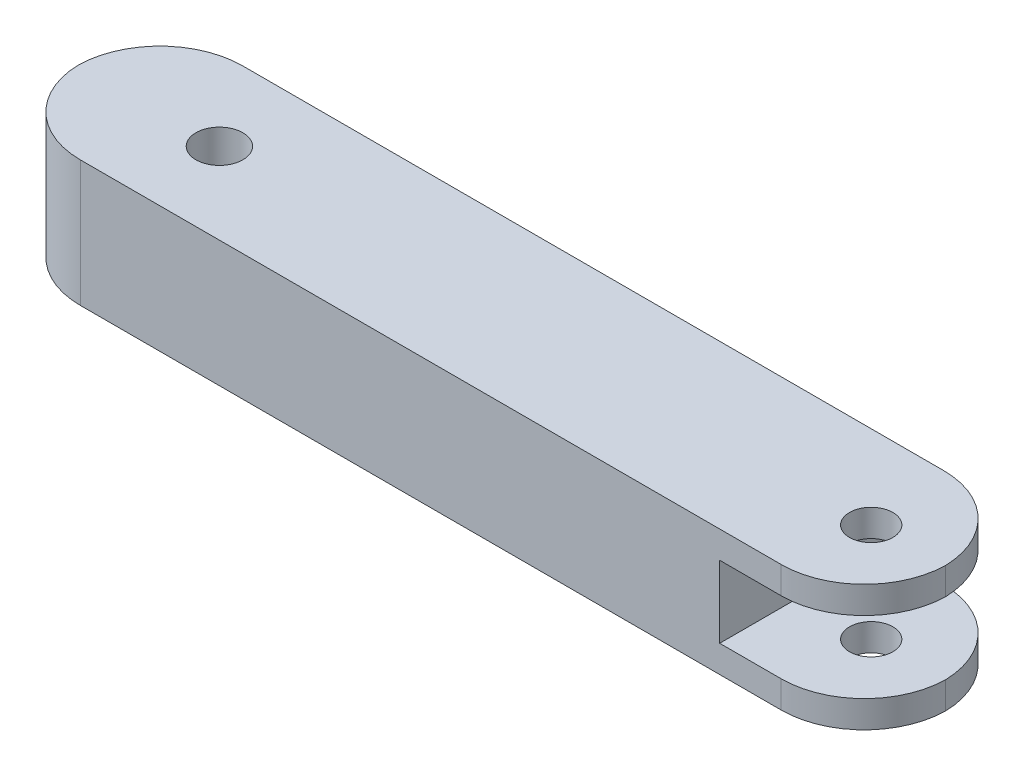
ISO-10303-21;
HEADER;
FILE_DESCRIPTION(('STEP AP214'),'2;1');
FILE_NAME('part.step','',(''),(''),'','','');
FILE_SCHEMA(('AUTOMOTIVE_DESIGN { 1 0 10303 214 1 1 1 1 }'));
ENDSEC;
DATA;
#1=APPLICATION_CONTEXT('core data for automotive mechanical design processes');
#2=APPLICATION_PROTOCOL_DEFINITION('international standard','automotive_design',2000,#1);
#3=PRODUCT_CONTEXT('',#1,'mechanical');
#4=PRODUCT('Part','Part','',(#3));
#5=PRODUCT_RELATED_PRODUCT_CATEGORY('part','',(#4));
#6=PRODUCT_DEFINITION_FORMATION('','',#4);
#7=PRODUCT_DEFINITION_CONTEXT('part definition',#1,'design');
#8=PRODUCT_DEFINITION('design','',#6,#7);
#9=PRODUCT_DEFINITION_SHAPE('','',#8);
#10=(LENGTH_UNIT() NAMED_UNIT(*) SI_UNIT(.MILLI.,.METRE.));
#11=(NAMED_UNIT(*) PLANE_ANGLE_UNIT() SI_UNIT($,.RADIAN.));
#12=(NAMED_UNIT(*) SI_UNIT($,.STERADIAN.) SOLID_ANGLE_UNIT());
#13=UNCERTAINTY_MEASURE_WITH_UNIT(LENGTH_MEASURE(1.E-05),#10,'distance_accuracy_value','');
#14=(GEOMETRIC_REPRESENTATION_CONTEXT(3) GLOBAL_UNCERTAINTY_ASSIGNED_CONTEXT((#13)) GLOBAL_UNIT_ASSIGNED_CONTEXT((#10,
#11,#12)) REPRESENTATION_CONTEXT('',''));
#15=CARTESIAN_POINT('',(0.,0.,0.));
#16=DIRECTION('',(0.,0.,1.));
#17=DIRECTION('',(1.,0.,0.));
#18=AXIS2_PLACEMENT_3D('',#15,#16,#17);
#19=CARTESIAN_POINT('',(-29.569717112966,10.819,11.4289156626506));
#20=DIRECTION('',(0.,0.,-1.));
#21=DIRECTION('',(-1.,0.,0.));
#22=AXIS2_PLACEMENT_3D('',#19,#20,#21);
#23=PLANE('',#22);
#24=DIRECTION('',(1.,0.,0.));
#25=VECTOR('',#24,1.);
#26=CARTESIAN_POINT('',(-29.569717112966,2.325,11.4289156626506));
#27=LINE('',#26,#25);
#28=CARTESIAN_POINT('',(32.4285979053255,2.325,11.4289156626506));
#29=VERTEX_POINT('',#28);
#30=CARTESIAN_POINT('',(37.700282887034,2.325,11.4289156626506));
#31=VERTEX_POINT('',#30);
#32=EDGE_CURVE('E155',#29,#31,#27,.T.);
#33=ORIENTED_EDGE('',*,*,#32,.F.);
#34=DIRECTION('',(0.,1.,0.));
#35=VECTOR('',#34,1.);
#36=CARTESIAN_POINT('',(32.4285979053255,10.819,11.4289156626506));
#37=LINE('',#36,#35);
#38=CARTESIAN_POINT('',(32.4285979053255,8.494,11.4289156626506));
#39=VERTEX_POINT('',#38);
#40=EDGE_CURVE('E140',#29,#39,#37,.T.);
#41=ORIENTED_EDGE('',*,*,#40,.T.);
#42=DIRECTION('',(1.,0.,0.));
#43=VECTOR('',#42,1.);
#44=CARTESIAN_POINT('',(-29.569717112966,8.494,11.4289156626506));
#45=LINE('',#44,#43);
#46=CARTESIAN_POINT('',(37.700282887034,8.494,11.4289156626506));
#47=VERTEX_POINT('',#46);
#48=EDGE_CURVE('E147',#39,#47,#45,.T.);
#49=ORIENTED_EDGE('',*,*,#48,.T.);
#50=DIRECTION('',(0.,-1.,0.));
#51=VECTOR('',#50,1.);
#52=CARTESIAN_POINT('',(37.700282887034,10.819,11.4289156626506));
#53=LINE('',#52,#51);
#54=CARTESIAN_POINT('',(37.700282887034,10.819,11.4289156626506));
#55=VERTEX_POINT('',#54);
#56=EDGE_CURVE('E165',#47,#55,#53,.F.);
#57=ORIENTED_EDGE('',*,*,#56,.T.);
#58=DIRECTION('',(1.,0.,0.));
#59=VECTOR('',#58,1.);
#60=CARTESIAN_POINT('',(-29.569717112966,10.819,11.4289156626506));
#61=LINE('',#60,#59);
#62=CARTESIAN_POINT('',(-22.439717112966,10.819,11.4289156626506));
#63=VERTEX_POINT('',#62);
#64=EDGE_CURVE('E159',#63,#55,#61,.T.);
#65=ORIENTED_EDGE('',*,*,#64,.F.);
#66=DIRECTION('',(0.,-1.,0.));
#67=VECTOR('',#66,1.);
#68=CARTESIAN_POINT('',(-22.439717112966,10.819,11.4289156626506));
#69=LINE('',#68,#67);
#70=CARTESIAN_POINT('',(-22.439717112966,0.,11.4289156626506));
#71=VERTEX_POINT('',#70);
#72=EDGE_CURVE('E175',#63,#71,#69,.T.);
#73=ORIENTED_EDGE('',*,*,#72,.T.);
#74=DIRECTION('',(1.,0.,0.));
#75=VECTOR('',#74,1.);
#76=CARTESIAN_POINT('',(-29.569717112966,0.,11.4289156626506));
#77=LINE('',#76,#75);
#78=CARTESIAN_POINT('',(37.700282887034,0.,11.4289156626506));
#79=VERTEX_POINT('',#78);
#80=EDGE_CURVE('E166',#71,#79,#77,.T.);
#81=ORIENTED_EDGE('',*,*,#80,.T.);
#82=EDGE_CURVE('E172',#79,#31,#53,.F.);
#83=ORIENTED_EDGE('',*,*,#82,.T.);
#84=EDGE_LOOP('',(#33,#41,#49,#57,#65,#73,#81,#83));
#85=FACE_BOUND('',#84,.T.);
#86=ADVANCED_FACE('F38',(#85),#23,.F.);
#87=CARTESIAN_POINT('',(-29.569717112966,10.819,-2.5210843373494));
#88=DIRECTION('',(0.,0.,1.));
#89=DIRECTION('',(1.,0.,0.));
#90=AXIS2_PLACEMENT_3D('',#87,#88,#89);
#91=PLANE('',#90);
#92=DIRECTION('',(-1.,0.,0.));
#93=VECTOR('',#92,1.);
#94=CARTESIAN_POINT('',(32.4285979053255,2.325,-2.5210843373494));
#95=LINE('',#94,#93);
#96=CARTESIAN_POINT('',(37.700282887034,2.325,-2.5210843373494));
#97=VERTEX_POINT('',#96);
#98=CARTESIAN_POINT('',(32.4285979053255,2.325,-2.5210843373494));
#99=VERTEX_POINT('',#98);
#100=EDGE_CURVE('E123',#97,#99,#95,.T.);
#101=ORIENTED_EDGE('',*,*,#100,.F.);
#102=DIRECTION('',(0.,-1.,0.));
#103=VECTOR('',#102,1.);
#104=CARTESIAN_POINT('',(37.700282887034,10.819,-2.5210843373494));
#105=LINE('',#104,#103);
#106=CARTESIAN_POINT('',(37.700282887034,0.,-2.5210843373494));
#107=VERTEX_POINT('',#106);
#108=EDGE_CURVE('E194',#97,#107,#105,.T.);
#109=ORIENTED_EDGE('',*,*,#108,.T.);
#110=DIRECTION('',(-1.,0.,0.));
#111=VECTOR('',#110,1.);
#112=CARTESIAN_POINT('',(-29.569717112966,0.,-2.5210843373494));
#113=LINE('',#112,#111);
#114=CARTESIAN_POINT('',(-22.439717112966,0.,-2.5210843373494));
#115=VERTEX_POINT('',#114);
#116=EDGE_CURVE('E163',#107,#115,#113,.T.);
#117=ORIENTED_EDGE('',*,*,#116,.T.);
#118=DIRECTION('',(0.,-1.,0.));
#119=VECTOR('',#118,1.);
#120=CARTESIAN_POINT('',(-22.439717112966,10.819,-2.5210843373494));
#121=LINE('',#120,#119);
#122=CARTESIAN_POINT('',(-22.439717112966,10.819,-2.5210843373494));
#123=VERTEX_POINT('',#122);
#124=EDGE_CURVE('E197',#115,#123,#121,.F.);
#125=ORIENTED_EDGE('',*,*,#124,.T.);
#126=DIRECTION('',(-1.,0.,0.));
#127=VECTOR('',#126,1.);
#128=CARTESIAN_POINT('',(-29.569717112966,10.819,-2.5210843373494));
#129=LINE('',#128,#127);
#130=CARTESIAN_POINT('',(37.700282887034,10.819,-2.5210843373494));
#131=VERTEX_POINT('',#130);
#132=EDGE_CURVE('E162',#131,#123,#129,.T.);
#133=ORIENTED_EDGE('',*,*,#132,.F.);
#134=CARTESIAN_POINT('',(37.700282887034,8.494,-2.5210843373494));
#135=VERTEX_POINT('',#134);
#136=EDGE_CURVE('E195',#131,#135,#105,.T.);
#137=ORIENTED_EDGE('',*,*,#136,.T.);
#138=DIRECTION('',(-1.,0.,0.));
#139=VECTOR('',#138,1.);
#140=CARTESIAN_POINT('',(32.4285979053255,8.494,-2.5210843373494));
#141=LINE('',#140,#139);
#142=CARTESIAN_POINT('',(32.4285979053255,8.494,-2.5210843373494));
#143=VERTEX_POINT('',#142);
#144=EDGE_CURVE('E141',#135,#143,#141,.T.);
#145=ORIENTED_EDGE('',*,*,#144,.T.);
#146=DIRECTION('',(0.,1.,0.));
#147=VECTOR('',#146,1.);
#148=CARTESIAN_POINT('',(32.4285979053255,2.325,-2.5210843373494));
#149=LINE('',#148,#147);
#150=EDGE_CURVE('E133',#99,#143,#149,.T.);
#151=ORIENTED_EDGE('',*,*,#150,.F.);
#152=EDGE_LOOP('',(#101,#109,#117,#125,#133,#137,#145,#151));
#153=FACE_BOUND('',#152,.T.);
#154=ADVANCED_FACE('F144',(#153),#91,.F.);
#155=CARTESIAN_POINT('',(37.700282887034,10.819,4.6089156626506));
#156=DIRECTION('',(0.,-1.,0.));
#157=DIRECTION('',(0.,0.,-1.));
#158=AXIS2_PLACEMENT_3D('',#155,#156,#157);
#159=CYLINDRICAL_SURFACE('',#158,7.13);
#160=ORIENTED_EDGE('',*,*,#108,.F.);
#161=CARTESIAN_POINT('',(37.700282887034,2.325,4.6089156626506));
#162=DIRECTION('',(0.,1.,0.));
#163=DIRECTION('',(0.,0.,1.));
#164=AXIS2_PLACEMENT_3D('',#161,#162,#163);
#165=CIRCLE('',#164,7.13);
#166=CARTESIAN_POINT('',(44.8285979053255,2.325,4.4539156626506));
#167=VERTEX_POINT('',#166);
#168=EDGE_CURVE('E129',#97,#167,#165,.F.);
#169=ORIENTED_EDGE('',*,*,#168,.T.);
#170=DIRECTION('',(0.,-1.,0.));
#171=VECTOR('',#170,1.);
#172=CARTESIAN_POINT('',(44.8285979053255,5.4095,4.4539156626506));
#173=LINE('',#172,#171);
#174=CARTESIAN_POINT('',(44.8285979053255,0.,4.4539156626506));
#175=VERTEX_POINT('',#174);
#176=EDGE_CURVE('E201',#175,#167,#173,.F.);
#177=ORIENTED_EDGE('',*,*,#176,.F.);
#178=CARTESIAN_POINT('',(37.700282887034,0.,4.6089156626506));
#179=DIRECTION('',(0.,-1.,0.));
#180=DIRECTION('',(0.,0.,-1.));
#181=AXIS2_PLACEMENT_3D('',#178,#179,#180);
#182=CIRCLE('',#181,7.13);
#183=EDGE_CURVE('E178',#107,#175,#182,.T.);
#184=ORIENTED_EDGE('',*,*,#183,.F.);
#185=EDGE_LOOP('',(#160,#169,#177,#184));
#186=FACE_BOUND('',#185,.T.);
#187=ADVANCED_FACE('F230',(#186),#159,.T.);
#188=CARTESIAN_POINT('',(37.700282887034,10.819,4.2989156626506));
#189=DIRECTION('',(0.,-1.,0.));
#190=DIRECTION('',(0.,0.,-1.));
#191=AXIS2_PLACEMENT_3D('',#188,#189,#190);
#192=CYLINDRICAL_SURFACE('',#191,7.13);
#193=ORIENTED_EDGE('',*,*,#176,.T.);
#194=CARTESIAN_POINT('',(37.700282887034,2.325,4.2989156626506));
#195=DIRECTION('',(0.,1.,0.));
#196=DIRECTION('',(0.,0.,1.));
#197=AXIS2_PLACEMENT_3D('',#194,#195,#196);
#198=CIRCLE('',#197,7.13);
#199=EDGE_CURVE('E11',#167,#31,#198,.F.);
#200=ORIENTED_EDGE('',*,*,#199,.T.);
#201=ORIENTED_EDGE('',*,*,#82,.F.);
#202=CARTESIAN_POINT('',(37.700282887034,0.,4.2989156626506));
#203=DIRECTION('',(0.,-1.,0.));
#204=DIRECTION('',(0.,0.,-1.));
#205=AXIS2_PLACEMENT_3D('',#202,#203,#204);
#206=CIRCLE('',#205,7.13);
#207=EDGE_CURVE('E180',#175,#79,#206,.T.);
#208=ORIENTED_EDGE('',*,*,#207,.F.);
#209=EDGE_LOOP('',(#193,#200,#201,#208));
#210=FACE_BOUND('',#209,.T.);
#211=ADVANCED_FACE('F235',(#210),#192,.T.);
#212=CARTESIAN_POINT('',(0.,10.819,0.));
#213=DIRECTION('',(0.,-1.,0.));
#214=DIRECTION('',(0.,0.,-1.));
#215=AXIS2_PLACEMENT_3D('',#212,#213,#214);
#216=PLANE('',#215);
#217=CARTESIAN_POINT('',(-17.4780321312575,10.819,4.4539156626506));
#218=DIRECTION('',(0.,-1.,0.));
#219=DIRECTION('',(0.,0.,-1.));
#220=AXIS2_PLACEMENT_3D('',#217,#218,#219);
#221=CIRCLE('',#220,2.015);
#222=CARTESIAN_POINT('',(-17.4780321312575,10.819,2.4389156626506));
#223=VERTEX_POINT('',#222);
#224=EDGE_CURVE('E281',#223,#223,#221,.T.);
#225=ORIENTED_EDGE('',*,*,#224,.T.);
#226=EDGE_LOOP('',(#225));
#227=FACE_BOUND('',#226,.T.);
#228=CARTESIAN_POINT('',(38.6285979053255,10.819,4.62985196275662));
#229=DIRECTION('',(0.,-1.,0.));
#230=DIRECTION('',(0.,0.,-1.));
#231=AXIS2_PLACEMENT_3D('',#228,#229,#230);
#232=CIRCLE('',#231,1.86000000000001);
#233=CARTESIAN_POINT('',(38.6285979053255,10.819,2.76985196275661));
#234=VERTEX_POINT('',#233);
#235=EDGE_CURVE('E288',#234,#234,#232,.T.);
#236=ORIENTED_EDGE('',*,*,#235,.T.);
#237=EDGE_LOOP('',(#236));
#238=FACE_BOUND('',#237,.T.);
#239=CARTESIAN_POINT('',(-22.439717112966,10.819,4.6089156626506));
#240=DIRECTION('',(0.,-1.,0.));
#241=DIRECTION('',(0.,0.,-1.));
#242=AXIS2_PLACEMENT_3D('',#239,#240,#241);
#243=CIRCLE('',#242,7.13);
#244=CARTESIAN_POINT('',(-29.5680321312575,10.819,4.4539156626506));
#245=VERTEX_POINT('',#244);
#246=EDGE_CURVE('E62',#123,#245,#243,.F.);
#247=ORIENTED_EDGE('',*,*,#246,.T.);
#248=CARTESIAN_POINT('',(-22.439717112966,10.819,4.2989156626506));
#249=DIRECTION('',(0.,-1.,0.));
#250=DIRECTION('',(0.,0.,-1.));
#251=AXIS2_PLACEMENT_3D('',#248,#249,#250);
#252=CIRCLE('',#251,7.13);
#253=EDGE_CURVE('E192',#245,#63,#252,.F.);
#254=ORIENTED_EDGE('',*,*,#253,.T.);
#255=ORIENTED_EDGE('',*,*,#64,.T.);
#256=CARTESIAN_POINT('',(37.700282887034,10.819,4.2989156626506));
#257=DIRECTION('',(0.,-1.,0.));
#258=DIRECTION('',(0.,0.,-1.));
#259=AXIS2_PLACEMENT_3D('',#256,#257,#258);
#260=CIRCLE('',#259,7.13);
#261=CARTESIAN_POINT('',(44.8285979053255,10.819,4.4539156626506));
#262=VERTEX_POINT('',#261);
#263=EDGE_CURVE('E188',#55,#262,#260,.F.);
#264=ORIENTED_EDGE('',*,*,#263,.T.);
#265=CARTESIAN_POINT('',(37.700282887034,10.819,4.6089156626506));
#266=DIRECTION('',(0.,-1.,0.));
#267=DIRECTION('',(0.,0.,-1.));
#268=AXIS2_PLACEMENT_3D('',#265,#266,#267);
#269=CIRCLE('',#268,7.13);
#270=EDGE_CURVE('E186',#262,#131,#269,.F.);
#271=ORIENTED_EDGE('',*,*,#270,.T.);
#272=ORIENTED_EDGE('',*,*,#132,.T.);
#273=EDGE_LOOP('',(#247,#254,#255,#264,#271,#272));
#274=FACE_BOUND('',#273,.T.);
#275=ADVANCED_FACE('F213',(#227,#238,#274),#216,.F.);
#276=CARTESIAN_POINT('',(0.,0.,0.));
#277=DIRECTION('',(0.,-1.,0.));
#278=DIRECTION('',(0.,0.,-1.));
#279=AXIS2_PLACEMENT_3D('',#276,#277,#278);
#280=PLANE('',#279);
#281=CARTESIAN_POINT('',(-17.4780321312575,0.,4.4539156626506));
#282=DIRECTION('',(0.,-1.,0.));
#283=DIRECTION('',(0.,0.,-1.));
#284=AXIS2_PLACEMENT_3D('',#281,#282,#283);
#285=CIRCLE('',#284,2.015);
#286=CARTESIAN_POINT('',(-17.4780321312575,0.,2.4389156626506));
#287=VERTEX_POINT('',#286);
#288=EDGE_CURVE('E283',#287,#287,#285,.T.);
#289=ORIENTED_EDGE('',*,*,#288,.F.);
#290=EDGE_LOOP('',(#289));
#291=FACE_BOUND('',#290,.T.);
#292=CARTESIAN_POINT('',(38.6285979053255,0.,4.62985196275662));
#293=DIRECTION('',(0.,-1.,0.));
#294=DIRECTION('',(0.,0.,-1.));
#295=AXIS2_PLACEMENT_3D('',#292,#293,#294);
#296=CIRCLE('',#295,1.86000000000001);
#297=CARTESIAN_POINT('',(38.6285979053255,0.,2.76985196275661));
#298=VERTEX_POINT('',#297);
#299=EDGE_CURVE('E285',#298,#298,#296,.T.);
#300=ORIENTED_EDGE('',*,*,#299,.F.);
#301=EDGE_LOOP('',(#300));
#302=FACE_BOUND('',#301,.T.);
#303=ORIENTED_EDGE('',*,*,#80,.F.);
#304=CARTESIAN_POINT('',(-22.439717112966,0.,4.2989156626506));
#305=DIRECTION('',(0.,-1.,0.));
#306=DIRECTION('',(0.,0.,-1.));
#307=AXIS2_PLACEMENT_3D('',#304,#305,#306);
#308=CIRCLE('',#307,7.13);
#309=CARTESIAN_POINT('',(-29.5680321312575,0.,4.4539156626506));
#310=VERTEX_POINT('',#309);
#311=EDGE_CURVE('E184',#71,#310,#308,.T.);
#312=ORIENTED_EDGE('',*,*,#311,.T.);
#313=CARTESIAN_POINT('',(-22.439717112966,0.,4.6089156626506));
#314=DIRECTION('',(0.,-1.,0.));
#315=DIRECTION('',(0.,0.,-1.));
#316=AXIS2_PLACEMENT_3D('',#313,#314,#315);
#317=CIRCLE('',#316,7.13);
#318=EDGE_CURVE('E182',#310,#115,#317,.T.);
#319=ORIENTED_EDGE('',*,*,#318,.T.);
#320=ORIENTED_EDGE('',*,*,#116,.F.);
#321=ORIENTED_EDGE('',*,*,#183,.T.);
#322=ORIENTED_EDGE('',*,*,#207,.T.);
#323=EDGE_LOOP('',(#303,#312,#319,#320,#321,#322));
#324=FACE_BOUND('',#323,.T.);
#325=ADVANCED_FACE('F221',(#291,#302,#324),#280,.T.);
#326=CARTESIAN_POINT('',(-22.439717112966,10.819,4.6089156626506));
#327=DIRECTION('',(0.,-1.,0.));
#328=DIRECTION('',(0.,0.,-1.));
#329=AXIS2_PLACEMENT_3D('',#326,#327,#328);
#330=CYLINDRICAL_SURFACE('',#329,7.13);
#331=DIRECTION('',(0.,-1.,0.));
#332=VECTOR('',#331,1.);
#333=CARTESIAN_POINT('',(-29.5680321312575,5.4095,4.4539156626506));
#334=LINE('',#333,#332);
#335=EDGE_CURVE('E169',#245,#310,#334,.T.);
#336=ORIENTED_EDGE('',*,*,#335,.F.);
#337=ORIENTED_EDGE('',*,*,#246,.F.);
#338=ORIENTED_EDGE('',*,*,#124,.F.);
#339=ORIENTED_EDGE('',*,*,#318,.F.);
#340=EDGE_LOOP('',(#336,#337,#338,#339));
#341=FACE_BOUND('',#340,.T.);
#342=ADVANCED_FACE('F225',(#341),#330,.T.);
#343=CARTESIAN_POINT('',(-22.439717112966,10.819,4.2989156626506));
#344=DIRECTION('',(0.,-1.,0.));
#345=DIRECTION('',(0.,0.,-1.));
#346=AXIS2_PLACEMENT_3D('',#343,#344,#345);
#347=CYLINDRICAL_SURFACE('',#346,7.13);
#348=ORIENTED_EDGE('',*,*,#253,.F.);
#349=ORIENTED_EDGE('',*,*,#335,.T.);
#350=ORIENTED_EDGE('',*,*,#311,.F.);
#351=ORIENTED_EDGE('',*,*,#72,.F.);
#352=EDGE_LOOP('',(#348,#349,#350,#351));
#353=FACE_BOUND('',#352,.T.);
#354=ADVANCED_FACE('F218',(#353),#347,.T.);
#355=CARTESIAN_POINT('',(37.700282887034,8.494,4.6089156626506));
#356=DIRECTION('',(0.,1.,0.));
#357=DIRECTION('',(0.,0.,1.));
#358=AXIS2_PLACEMENT_3D('',#355,#356,#357);
#359=CIRCLE('',#358,7.13);
#360=CARTESIAN_POINT('',(44.8285979053255,8.494,4.4539156626506));
#361=VERTEX_POINT('',#360);
#362=EDGE_CURVE('E54',#135,#361,#359,.F.);
#363=ORIENTED_EDGE('',*,*,#362,.F.);
#364=ORIENTED_EDGE('',*,*,#136,.F.);
#365=ORIENTED_EDGE('',*,*,#270,.F.);
#366=EDGE_CURVE('E158',#361,#262,#173,.F.);
#367=ORIENTED_EDGE('',*,*,#366,.F.);
#368=EDGE_LOOP('',(#363,#364,#365,#367));
#369=FACE_BOUND('',#368,.T.);
#370=ADVANCED_FACE('F40',(#369),#159,.T.);
#371=CARTESIAN_POINT('',(37.700282887034,8.494,4.2989156626506));
#372=DIRECTION('',(0.,1.,0.));
#373=DIRECTION('',(0.,0.,1.));
#374=AXIS2_PLACEMENT_3D('',#371,#372,#373);
#375=CIRCLE('',#374,7.13);
#376=EDGE_CURVE('E47',#361,#47,#375,.F.);
#377=ORIENTED_EDGE('',*,*,#376,.F.);
#378=ORIENTED_EDGE('',*,*,#366,.T.);
#379=ORIENTED_EDGE('',*,*,#263,.F.);
#380=ORIENTED_EDGE('',*,*,#56,.F.);
#381=EDGE_LOOP('',(#377,#378,#379,#380));
#382=FACE_BOUND('',#381,.T.);
#383=ADVANCED_FACE('F211',(#382),#192,.T.);
#384=CARTESIAN_POINT('',(32.4285979053255,2.325,-2.5210843373494));
#385=DIRECTION('',(-1.,0.,0.));
#386=DIRECTION('',(0.,0.,1.));
#387=AXIS2_PLACEMENT_3D('',#384,#385,#386);
#388=PLANE('',#387);
#389=DIRECTION('',(0.,0.,1.));
#390=VECTOR('',#389,1.);
#391=CARTESIAN_POINT('',(32.4285979053255,2.325,-2.5210843373494));
#392=LINE('',#391,#390);
#393=EDGE_CURVE('E126',#99,#29,#392,.T.);
#394=ORIENTED_EDGE('',*,*,#393,.F.);
#395=ORIENTED_EDGE('',*,*,#150,.T.);
#396=DIRECTION('',(0.,0.,1.));
#397=VECTOR('',#396,1.);
#398=CARTESIAN_POINT('',(32.4285979053255,8.494,-2.5210843373494));
#399=LINE('',#398,#397);
#400=EDGE_CURVE('E295',#143,#39,#399,.T.);
#401=ORIENTED_EDGE('',*,*,#400,.T.);
#402=ORIENTED_EDGE('',*,*,#40,.F.);
#403=EDGE_LOOP('',(#394,#395,#401,#402));
#404=FACE_BOUND('',#403,.T.);
#405=ADVANCED_FACE('F136',(#404),#388,.F.);
#406=CARTESIAN_POINT('',(0.,2.325,0.));
#407=DIRECTION('',(0.,1.,0.));
#408=DIRECTION('',(0.,0.,1.));
#409=AXIS2_PLACEMENT_3D('',#406,#407,#408);
#410=PLANE('',#409);
#411=CARTESIAN_POINT('',(38.6285979053255,2.325,4.62985196275662));
#412=DIRECTION('',(0.,1.,0.));
#413=DIRECTION('',(0.,0.,1.));
#414=AXIS2_PLACEMENT_3D('',#411,#412,#413);
#415=CIRCLE('',#414,1.86000000000001);
#416=CARTESIAN_POINT('',(38.6285979053255,2.325,6.48985196275663));
#417=VERTEX_POINT('',#416);
#418=EDGE_CURVE('E293',#417,#417,#415,.T.);
#419=ORIENTED_EDGE('',*,*,#418,.F.);
#420=EDGE_LOOP('',(#419));
#421=FACE_BOUND('',#420,.T.);
#422=ORIENTED_EDGE('',*,*,#32,.T.);
#423=ORIENTED_EDGE('',*,*,#199,.F.);
#424=ORIENTED_EDGE('',*,*,#168,.F.);
#425=ORIENTED_EDGE('',*,*,#100,.T.);
#426=ORIENTED_EDGE('',*,*,#393,.T.);
#427=EDGE_LOOP('',(#422,#423,#424,#425,#426));
#428=FACE_BOUND('',#427,.T.);
#429=ADVANCED_FACE('F125',(#421,#428),#410,.T.);
#430=CARTESIAN_POINT('',(0.,8.494,0.));
#431=DIRECTION('',(0.,1.,0.));
#432=DIRECTION('',(0.,0.,1.));
#433=AXIS2_PLACEMENT_3D('',#430,#431,#432);
#434=PLANE('',#433);
#435=CARTESIAN_POINT('',(38.6285979053255,8.494,4.62985196275662));
#436=DIRECTION('',(0.,1.,0.));
#437=DIRECTION('',(0.,0.,1.));
#438=AXIS2_PLACEMENT_3D('',#435,#436,#437);
#439=CIRCLE('',#438,1.86000000000001);
#440=CARTESIAN_POINT('',(38.6285979053255,8.494,6.48985196275663));
#441=VERTEX_POINT('',#440);
#442=EDGE_CURVE('E42',#441,#441,#439,.T.);
#443=ORIENTED_EDGE('',*,*,#442,.T.);
#444=EDGE_LOOP('',(#443));
#445=FACE_BOUND('',#444,.T.);
#446=ORIENTED_EDGE('',*,*,#400,.F.);
#447=ORIENTED_EDGE('',*,*,#144,.F.);
#448=ORIENTED_EDGE('',*,*,#362,.T.);
#449=ORIENTED_EDGE('',*,*,#376,.T.);
#450=ORIENTED_EDGE('',*,*,#48,.F.);
#451=EDGE_LOOP('',(#446,#447,#448,#449,#450));
#452=FACE_BOUND('',#451,.T.);
#453=ADVANCED_FACE('F204',(#445,#452),#434,.F.);
#454=CARTESIAN_POINT('',(38.6285979053255,10.819,4.62985196275662));
#455=DIRECTION('',(0.,-1.,0.));
#456=DIRECTION('',(0.,0.,-1.));
#457=AXIS2_PLACEMENT_3D('',#454,#455,#456);
#458=CYLINDRICAL_SURFACE('',#457,1.86000000000001);
#459=ORIENTED_EDGE('',*,*,#235,.F.);
#460=EDGE_LOOP('',(#459));
#461=FACE_BOUND('',#460,.T.);
#462=ORIENTED_EDGE('',*,*,#442,.F.);
#463=EDGE_LOOP('',(#462));
#464=FACE_BOUND('',#463,.T.);
#465=ADVANCED_FACE('F264',(#461,#464),#458,.F.);
#466=ORIENTED_EDGE('',*,*,#418,.T.);
#467=EDGE_LOOP('',(#466));
#468=FACE_BOUND('',#467,.T.);
#469=ORIENTED_EDGE('',*,*,#299,.T.);
#470=EDGE_LOOP('',(#469));
#471=FACE_BOUND('',#470,.T.);
#472=ADVANCED_FACE('F269',(#468,#471),#458,.F.);
#473=CARTESIAN_POINT('',(-17.4780321312575,10.819,4.4539156626506));
#474=DIRECTION('',(0.,-1.,0.));
#475=DIRECTION('',(0.,0.,-1.));
#476=AXIS2_PLACEMENT_3D('',#473,#474,#475);
#477=CYLINDRICAL_SURFACE('',#476,2.015);
#478=ORIENTED_EDGE('',*,*,#224,.F.);
#479=EDGE_LOOP('',(#478));
#480=FACE_BOUND('',#479,.T.);
#481=ORIENTED_EDGE('',*,*,#288,.T.);
#482=EDGE_LOOP('',(#481));
#483=FACE_BOUND('',#482,.T.);
#484=ADVANCED_FACE('F272',(#480,#483),#477,.F.);
#485=CLOSED_SHELL('',(#86,#154,#187,#211,#275,#325,#342,#354,#370,#383,#405,#429,#453,#465,#472,#484));
#486=MANIFOLD_SOLID_BREP('B2',#485);
#487=ADVANCED_BREP_SHAPE_REPRESENTATION('',(#18,#486),#14);
#488=SHAPE_DEFINITION_REPRESENTATION(#9,#487);
ENDSEC;
END-ISO-10303-21;
